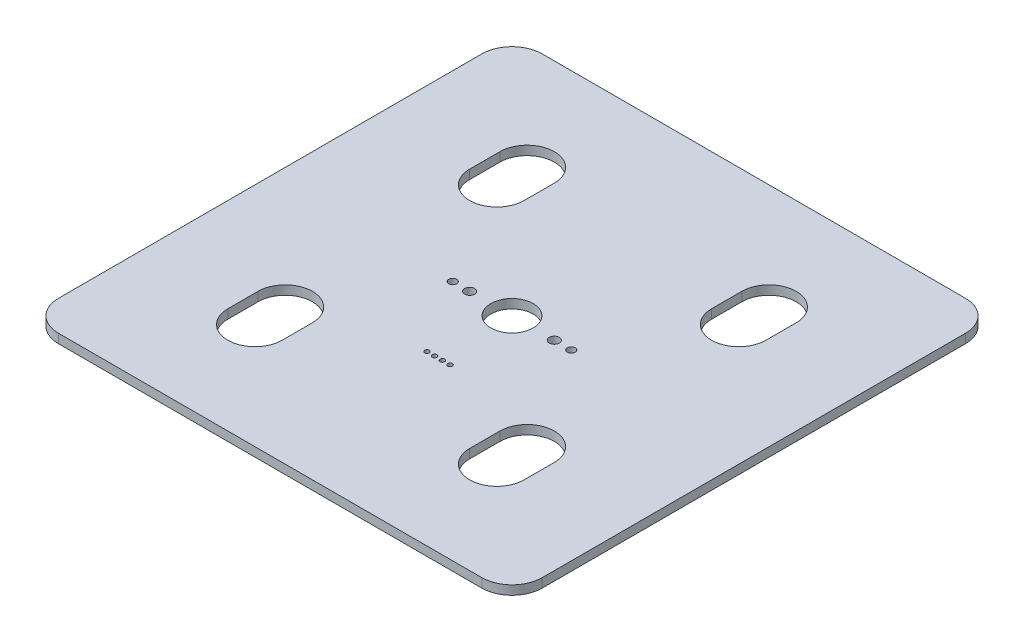
ISO-10303-21;
HEADER;
FILE_DESCRIPTION(('STEP AP214'),'2;1');
FILE_NAME('part.step','',(''),(''),'','','');
FILE_SCHEMA(('AUTOMOTIVE_DESIGN { 1 0 10303 214 1 1 1 1 }'));
ENDSEC;
DATA;
#1=APPLICATION_CONTEXT('core data for automotive mechanical design processes');
#2=APPLICATION_PROTOCOL_DEFINITION('international standard','automotive_design',2000,#1);
#3=PRODUCT_CONTEXT('',#1,'mechanical');
#4=PRODUCT('Part','Part','',(#3));
#5=PRODUCT_RELATED_PRODUCT_CATEGORY('part','',(#4));
#6=PRODUCT_DEFINITION_FORMATION('','',#4);
#7=PRODUCT_DEFINITION_CONTEXT('part definition',#1,'design');
#8=PRODUCT_DEFINITION('design','',#6,#7);
#9=PRODUCT_DEFINITION_SHAPE('','',#8);
#10=(LENGTH_UNIT() NAMED_UNIT(*) SI_UNIT(.MILLI.,.METRE.));
#11=(NAMED_UNIT(*) PLANE_ANGLE_UNIT() SI_UNIT($,.RADIAN.));
#12=(NAMED_UNIT(*) SI_UNIT($,.STERADIAN.) SOLID_ANGLE_UNIT());
#13=UNCERTAINTY_MEASURE_WITH_UNIT(LENGTH_MEASURE(1.E-05),#10,'distance_accuracy_value','');
#14=(GEOMETRIC_REPRESENTATION_CONTEXT(3) GLOBAL_UNCERTAINTY_ASSIGNED_CONTEXT((#13)) GLOBAL_UNIT_ASSIGNED_CONTEXT((#10,
#11,#12)) REPRESENTATION_CONTEXT('',''));
#15=CARTESIAN_POINT('',(0.,0.,0.));
#16=DIRECTION('',(0.,0.,1.));
#17=DIRECTION('',(1.,0.,0.));
#18=AXIS2_PLACEMENT_3D('',#15,#16,#17);
#19=CARTESIAN_POINT('',(35.,0.75,35.));
#20=DIRECTION('',(0.,-1.,0.));
#21=DIRECTION('',(0.,0.,-1.));
#22=AXIS2_PLACEMENT_3D('',#19,#20,#21);
#23=CYLINDRICAL_SURFACE('',#22,5.);
#24=DIRECTION('',(0.,-1.,0.));
#25=VECTOR('',#24,1.);
#26=CARTESIAN_POINT('',(40.,0.75,35.));
#27=LINE('',#26,#25);
#28=CARTESIAN_POINT('',(40.,0.75,35.));
#29=VERTEX_POINT('',#28);
#30=CARTESIAN_POINT('',(40.,-0.75,35.));
#31=VERTEX_POINT('',#30);
#32=EDGE_CURVE('E264',#29,#31,#27,.T.);
#33=ORIENTED_EDGE('',*,*,#32,.F.);
#34=CARTESIAN_POINT('',(35.,0.75,35.));
#35=DIRECTION('',(0.,-1.,0.));
#36=DIRECTION('',(0.,0.,-1.));
#37=AXIS2_PLACEMENT_3D('',#34,#35,#36);
#38=CIRCLE('',#37,5.);
#39=CARTESIAN_POINT('',(35.,0.75,40.));
#40=VERTEX_POINT('',#39);
#41=EDGE_CURVE('E45',#40,#29,#38,.F.);
#42=ORIENTED_EDGE('',*,*,#41,.F.);
#43=DIRECTION('',(0.,-1.,0.));
#44=VECTOR('',#43,1.);
#45=CARTESIAN_POINT('',(35.,0.75,40.));
#46=LINE('',#45,#44);
#47=CARTESIAN_POINT('',(35.,-0.75,40.));
#48=VERTEX_POINT('',#47);
#49=EDGE_CURVE('E266',#48,#40,#46,.F.);
#50=ORIENTED_EDGE('',*,*,#49,.F.);
#51=CARTESIAN_POINT('',(35.,-0.75,35.));
#52=DIRECTION('',(0.,-1.,0.));
#53=DIRECTION('',(0.,0.,-1.));
#54=AXIS2_PLACEMENT_3D('',#51,#52,#53);
#55=CIRCLE('',#54,5.);
#56=EDGE_CURVE('E11',#31,#48,#55,.T.);
#57=ORIENTED_EDGE('',*,*,#56,.F.);
#58=EDGE_LOOP('',(#33,#42,#50,#57));
#59=FACE_BOUND('',#58,.T.);
#60=ADVANCED_FACE('F37',(#59),#23,.T.);
#61=CARTESIAN_POINT('',(35.,0.75,-35.));
#62=DIRECTION('',(0.,-1.,0.));
#63=DIRECTION('',(0.,0.,-1.));
#64=AXIS2_PLACEMENT_3D('',#61,#62,#63);
#65=CYLINDRICAL_SURFACE('',#64,5.);
#66=DIRECTION('',(0.,-1.,0.));
#67=VECTOR('',#66,1.);
#68=CARTESIAN_POINT('',(35.,0.75,-40.));
#69=LINE('',#68,#67);
#70=CARTESIAN_POINT('',(35.,0.75,-40.));
#71=VERTEX_POINT('',#70);
#72=CARTESIAN_POINT('',(35.,-0.75,-40.));
#73=VERTEX_POINT('',#72);
#74=EDGE_CURVE('E255',#71,#73,#69,.T.);
#75=ORIENTED_EDGE('',*,*,#74,.F.);
#76=CARTESIAN_POINT('',(35.,0.75,-35.));
#77=DIRECTION('',(0.,-1.,0.));
#78=DIRECTION('',(0.,0.,-1.));
#79=AXIS2_PLACEMENT_3D('',#76,#77,#78);
#80=CIRCLE('',#79,5.);
#81=CARTESIAN_POINT('',(40.,0.75,-35.));
#82=VERTEX_POINT('',#81);
#83=EDGE_CURVE('E260',#82,#71,#80,.F.);
#84=ORIENTED_EDGE('',*,*,#83,.F.);
#85=DIRECTION('',(0.,-1.,0.));
#86=VECTOR('',#85,1.);
#87=CARTESIAN_POINT('',(40.,0.75,-35.));
#88=LINE('',#87,#86);
#89=CARTESIAN_POINT('',(40.,-0.75,-35.));
#90=VERTEX_POINT('',#89);
#91=EDGE_CURVE('E258',#90,#82,#88,.F.);
#92=ORIENTED_EDGE('',*,*,#91,.F.);
#93=CARTESIAN_POINT('',(35.,-0.75,-35.));
#94=DIRECTION('',(0.,-1.,0.));
#95=DIRECTION('',(0.,0.,-1.));
#96=AXIS2_PLACEMENT_3D('',#93,#94,#95);
#97=CIRCLE('',#96,5.);
#98=EDGE_CURVE('E262',#73,#90,#97,.T.);
#99=ORIENTED_EDGE('',*,*,#98,.F.);
#100=EDGE_LOOP('',(#75,#84,#92,#99));
#101=FACE_BOUND('',#100,.T.);
#102=ADVANCED_FACE('F372',(#101),#65,.T.);
#103=CARTESIAN_POINT('',(-35.,0.75,-35.));
#104=DIRECTION('',(0.,-1.,0.));
#105=DIRECTION('',(0.,0.,-1.));
#106=AXIS2_PLACEMENT_3D('',#103,#104,#105);
#107=CYLINDRICAL_SURFACE('',#106,5.);
#108=DIRECTION('',(0.,-1.,0.));
#109=VECTOR('',#108,1.);
#110=CARTESIAN_POINT('',(-40.,0.75,-35.));
#111=LINE('',#110,#109);
#112=CARTESIAN_POINT('',(-40.,0.75,-35.));
#113=VERTEX_POINT('',#112);
#114=CARTESIAN_POINT('',(-40.,-0.75,-35.));
#115=VERTEX_POINT('',#114);
#116=EDGE_CURVE('E244',#113,#115,#111,.T.);
#117=ORIENTED_EDGE('',*,*,#116,.F.);
#118=CARTESIAN_POINT('',(-35.,0.75,-35.));
#119=DIRECTION('',(0.,-1.,0.));
#120=DIRECTION('',(0.,0.,-1.));
#121=AXIS2_PLACEMENT_3D('',#118,#119,#120);
#122=CIRCLE('',#121,5.);
#123=CARTESIAN_POINT('',(-35.,0.75,-40.));
#124=VERTEX_POINT('',#123);
#125=EDGE_CURVE('E250',#124,#113,#122,.F.);
#126=ORIENTED_EDGE('',*,*,#125,.F.);
#127=DIRECTION('',(0.,-1.,0.));
#128=VECTOR('',#127,1.);
#129=CARTESIAN_POINT('',(-35.,0.75,-40.));
#130=LINE('',#129,#128);
#131=CARTESIAN_POINT('',(-35.,-0.75,-40.));
#132=VERTEX_POINT('',#131);
#133=EDGE_CURVE('E247',#132,#124,#130,.F.);
#134=ORIENTED_EDGE('',*,*,#133,.F.);
#135=CARTESIAN_POINT('',(-35.,-0.75,-35.));
#136=DIRECTION('',(0.,-1.,0.));
#137=DIRECTION('',(0.,0.,-1.));
#138=AXIS2_PLACEMENT_3D('',#135,#136,#137);
#139=CIRCLE('',#138,5.);
#140=EDGE_CURVE('E252',#115,#132,#139,.T.);
#141=ORIENTED_EDGE('',*,*,#140,.F.);
#142=EDGE_LOOP('',(#117,#126,#134,#141));
#143=FACE_BOUND('',#142,.T.);
#144=ADVANCED_FACE('F381',(#143),#107,.T.);
#145=CARTESIAN_POINT('',(-35.,0.75,35.));
#146=DIRECTION('',(0.,-1.,0.));
#147=DIRECTION('',(0.,0.,-1.));
#148=AXIS2_PLACEMENT_3D('',#145,#146,#147);
#149=CYLINDRICAL_SURFACE('',#148,5.);
#150=DIRECTION('',(0.,-1.,0.));
#151=VECTOR('',#150,1.);
#152=CARTESIAN_POINT('',(-35.,0.75,40.));
#153=LINE('',#152,#151);
#154=CARTESIAN_POINT('',(-35.,0.75,40.));
#155=VERTEX_POINT('',#154);
#156=CARTESIAN_POINT('',(-35.,-0.75,40.));
#157=VERTEX_POINT('',#156);
#158=EDGE_CURVE('E236',#155,#157,#153,.T.);
#159=ORIENTED_EDGE('',*,*,#158,.F.);
#160=CARTESIAN_POINT('',(-35.,0.75,35.));
#161=DIRECTION('',(0.,-1.,0.));
#162=DIRECTION('',(0.,0.,-1.));
#163=AXIS2_PLACEMENT_3D('',#160,#161,#162);
#164=CIRCLE('',#163,5.);
#165=CARTESIAN_POINT('',(-40.,0.75,35.));
#166=VERTEX_POINT('',#165);
#167=EDGE_CURVE('E241',#166,#155,#164,.F.);
#168=ORIENTED_EDGE('',*,*,#167,.F.);
#169=DIRECTION('',(0.,-1.,0.));
#170=VECTOR('',#169,1.);
#171=CARTESIAN_POINT('',(-40.,0.75,35.));
#172=LINE('',#171,#170);
#173=CARTESIAN_POINT('',(-40.,-0.75,35.));
#174=VERTEX_POINT('',#173);
#175=EDGE_CURVE('E238',#174,#166,#172,.F.);
#176=ORIENTED_EDGE('',*,*,#175,.F.);
#177=CARTESIAN_POINT('',(-35.,-0.75,35.));
#178=DIRECTION('',(0.,-1.,0.));
#179=DIRECTION('',(0.,0.,-1.));
#180=AXIS2_PLACEMENT_3D('',#177,#178,#179);
#181=CIRCLE('',#180,5.);
#182=EDGE_CURVE('E91',#157,#174,#181,.T.);
#183=ORIENTED_EDGE('',*,*,#182,.F.);
#184=EDGE_LOOP('',(#159,#168,#176,#183));
#185=FACE_BOUND('',#184,.T.);
#186=ADVANCED_FACE('F385',(#185),#149,.T.);
#187=CARTESIAN_POINT('',(40.,0.75,40.));
#188=DIRECTION('',(-1.,0.,0.));
#189=DIRECTION('',(0.,0.,1.));
#190=AXIS2_PLACEMENT_3D('',#187,#188,#189);
#191=PLANE('',#190);
#192=DIRECTION('',(0.,0.,-1.));
#193=VECTOR('',#192,1.);
#194=CARTESIAN_POINT('',(40.,0.75,40.));
#195=LINE('',#194,#193);
#196=EDGE_CURVE('E235',#29,#82,#195,.T.);
#197=ORIENTED_EDGE('',*,*,#196,.F.);
#198=ORIENTED_EDGE('',*,*,#32,.T.);
#199=DIRECTION('',(0.,0.,-1.));
#200=VECTOR('',#199,1.);
#201=CARTESIAN_POINT('',(40.,-0.75,40.));
#202=LINE('',#201,#200);
#203=EDGE_CURVE('E214',#31,#90,#202,.T.);
#204=ORIENTED_EDGE('',*,*,#203,.T.);
#205=ORIENTED_EDGE('',*,*,#91,.T.);
#206=EDGE_LOOP('',(#197,#198,#204,#205));
#207=FACE_BOUND('',#206,.T.);
#208=ADVANCED_FACE('F367',(#207),#191,.F.);
#209=CARTESIAN_POINT('',(-40.,0.75,-40.));
#210=DIRECTION('',(0.,0.,1.));
#211=DIRECTION('',(1.,0.,0.));
#212=AXIS2_PLACEMENT_3D('',#209,#210,#211);
#213=PLANE('',#212);
#214=DIRECTION('',(-1.,0.,0.));
#215=VECTOR('',#214,1.);
#216=CARTESIAN_POINT('',(-40.,0.75,-40.));
#217=LINE('',#216,#215);
#218=EDGE_CURVE('E353',#71,#124,#217,.T.);
#219=ORIENTED_EDGE('',*,*,#218,.F.);
#220=ORIENTED_EDGE('',*,*,#74,.T.);
#221=DIRECTION('',(-1.,0.,0.));
#222=VECTOR('',#221,1.);
#223=CARTESIAN_POINT('',(-40.,-0.75,-40.));
#224=LINE('',#223,#222);
#225=EDGE_CURVE('E218',#73,#132,#224,.T.);
#226=ORIENTED_EDGE('',*,*,#225,.T.);
#227=ORIENTED_EDGE('',*,*,#133,.T.);
#228=EDGE_LOOP('',(#219,#220,#226,#227));
#229=FACE_BOUND('',#228,.T.);
#230=ADVANCED_FACE('F376',(#229),#213,.F.);
#231=CARTESIAN_POINT('',(-40.,0.75,40.));
#232=DIRECTION('',(1.,0.,0.));
#233=DIRECTION('',(0.,0.,-1.));
#234=AXIS2_PLACEMENT_3D('',#231,#232,#233);
#235=PLANE('',#234);
#236=DIRECTION('',(0.,0.,1.));
#237=VECTOR('',#236,1.);
#238=CARTESIAN_POINT('',(-40.,0.75,40.));
#239=LINE('',#238,#237);
#240=EDGE_CURVE('E354',#113,#166,#239,.T.);
#241=ORIENTED_EDGE('',*,*,#240,.F.);
#242=ORIENTED_EDGE('',*,*,#116,.T.);
#243=DIRECTION('',(0.,0.,1.));
#244=VECTOR('',#243,1.);
#245=CARTESIAN_POINT('',(-40.,-0.75,40.));
#246=LINE('',#245,#244);
#247=EDGE_CURVE('E225',#115,#174,#246,.T.);
#248=ORIENTED_EDGE('',*,*,#247,.T.);
#249=ORIENTED_EDGE('',*,*,#175,.T.);
#250=EDGE_LOOP('',(#241,#242,#248,#249));
#251=FACE_BOUND('',#250,.T.);
#252=ADVANCED_FACE('F384',(#251),#235,.F.);
#253=CARTESIAN_POINT('',(-40.,0.75,40.));
#254=DIRECTION('',(0.,0.,-1.));
#255=DIRECTION('',(-1.,0.,0.));
#256=AXIS2_PLACEMENT_3D('',#253,#254,#255);
#257=PLANE('',#256);
#258=DIRECTION('',(1.,0.,0.));
#259=VECTOR('',#258,1.);
#260=CARTESIAN_POINT('',(-40.,-0.75,40.));
#261=LINE('',#260,#259);
#262=EDGE_CURVE('E232',#157,#48,#261,.T.);
#263=ORIENTED_EDGE('',*,*,#262,.T.);
#264=ORIENTED_EDGE('',*,*,#49,.T.);
#265=DIRECTION('',(1.,0.,0.));
#266=VECTOR('',#265,1.);
#267=CARTESIAN_POINT('',(-40.,0.75,40.));
#268=LINE('',#267,#266);
#269=EDGE_CURVE('E228',#155,#40,#268,.T.);
#270=ORIENTED_EDGE('',*,*,#269,.F.);
#271=ORIENTED_EDGE('',*,*,#158,.T.);
#272=EDGE_LOOP('',(#263,#264,#270,#271));
#273=FACE_BOUND('',#272,.T.);
#274=ADVANCED_FACE('F362',(#273),#257,.F.);
#275=CARTESIAN_POINT('',(0.,0.75,0.));
#276=DIRECTION('',(0.,-1.,0.));
#277=DIRECTION('',(0.,0.,-1.));
#278=AXIS2_PLACEMENT_3D('',#275,#276,#277);
#279=PLANE('',#278);
#280=CARTESIAN_POINT('',(-9.8,0.75,0.));
#281=DIRECTION('',(0.,-1.,0.));
#282=DIRECTION('',(0.,0.,-1.));
#283=AXIS2_PLACEMENT_3D('',#280,#281,#282);
#284=CIRCLE('',#283,0.649999999999999);
#285=CARTESIAN_POINT('',(-9.8,0.75,-0.649999999999998));
#286=VERTEX_POINT('',#285);
#287=EDGE_CURVE('E782',#286,#286,#284,.T.);
#288=ORIENTED_EDGE('',*,*,#287,.T.);
#289=EDGE_LOOP('',(#288));
#290=FACE_BOUND('',#289,.T.);
#291=CARTESIAN_POINT('',(9.8,0.75,0.));
#292=DIRECTION('',(0.,-1.,0.));
#293=DIRECTION('',(0.,0.,-1.));
#294=AXIS2_PLACEMENT_3D('',#291,#292,#293);
#295=CIRCLE('',#294,0.649999999999999);
#296=CARTESIAN_POINT('',(9.8,0.75,-0.649999999999998));
#297=VERTEX_POINT('',#296);
#298=EDGE_CURVE('E784',#297,#297,#295,.T.);
#299=ORIENTED_EDGE('',*,*,#298,.T.);
#300=EDGE_LOOP('',(#299));
#301=FACE_BOUND('',#300,.T.);
#302=CARTESIAN_POINT('',(0.634999999999999,0.75,12.15));
#303=DIRECTION('',(0.,-1.,0.));
#304=DIRECTION('',(0.,0.,-1.));
#305=AXIS2_PLACEMENT_3D('',#302,#303,#304);
#306=CIRCLE('',#305,0.38);
#307=CARTESIAN_POINT('',(0.634999999999999,0.75,11.77));
#308=VERTEX_POINT('',#307);
#309=EDGE_CURVE('E789',#308,#308,#306,.T.);
#310=ORIENTED_EDGE('',*,*,#309,.T.);
#311=EDGE_LOOP('',(#310));
#312=FACE_BOUND('',#311,.T.);
#313=CARTESIAN_POINT('',(1.905,0.75,12.15));
#314=DIRECTION('',(0.,-1.,0.));
#315=DIRECTION('',(0.,0.,-1.));
#316=AXIS2_PLACEMENT_3D('',#313,#314,#315);
#317=CIRCLE('',#316,0.380000000000002);
#318=CARTESIAN_POINT('',(1.905,0.75,11.77));
#319=VERTEX_POINT('',#318);
#320=EDGE_CURVE('E872',#319,#319,#317,.T.);
#321=ORIENTED_EDGE('',*,*,#320,.T.);
#322=EDGE_LOOP('',(#321));
#323=FACE_BOUND('',#322,.T.);
#324=CARTESIAN_POINT('',(7.,0.75,0.));
#325=DIRECTION('',(0.,-1.,0.));
#326=DIRECTION('',(0.,0.,-1.));
#327=AXIS2_PLACEMENT_3D('',#324,#325,#326);
#328=CIRCLE('',#327,0.825);
#329=CARTESIAN_POINT('',(7.,0.75,-0.824999999999999));
#330=VERTEX_POINT('',#329);
#331=EDGE_CURVE('E875',#330,#330,#328,.T.);
#332=ORIENTED_EDGE('',*,*,#331,.T.);
#333=EDGE_LOOP('',(#332));
#334=FACE_BOUND('',#333,.T.);
#335=CARTESIAN_POINT('',(-7.,0.75,0.));
#336=DIRECTION('',(0.,-1.,0.));
#337=DIRECTION('',(0.,0.,-1.));
#338=AXIS2_PLACEMENT_3D('',#335,#336,#337);
#339=CIRCLE('',#338,0.825);
#340=CARTESIAN_POINT('',(-7.,0.75,-0.824999999999999));
#341=VERTEX_POINT('',#340);
#342=EDGE_CURVE('E878',#341,#341,#339,.T.);
#343=ORIENTED_EDGE('',*,*,#342,.T.);
#344=EDGE_LOOP('',(#343));
#345=FACE_BOUND('',#344,.T.);
#346=CARTESIAN_POINT('',(-1.905,0.75,12.15));
#347=DIRECTION('',(0.,-1.,0.));
#348=DIRECTION('',(0.,0.,-1.));
#349=AXIS2_PLACEMENT_3D('',#346,#347,#348);
#350=CIRCLE('',#349,0.380000000000002);
#351=CARTESIAN_POINT('',(-1.905,0.75,11.77));
#352=VERTEX_POINT('',#351);
#353=EDGE_CURVE('E881',#352,#352,#350,.T.);
#354=ORIENTED_EDGE('',*,*,#353,.T.);
#355=EDGE_LOOP('',(#354));
#356=FACE_BOUND('',#355,.T.);
#357=CARTESIAN_POINT('',(-0.634999999999999,0.75,12.15));
#358=DIRECTION('',(0.,-1.,0.));
#359=DIRECTION('',(0.,0.,-1.));
#360=AXIS2_PLACEMENT_3D('',#357,#358,#359);
#361=CIRCLE('',#360,0.38);
#362=CARTESIAN_POINT('',(-0.634999999999999,0.75,11.77));
#363=VERTEX_POINT('',#362);
#364=EDGE_CURVE('E884',#363,#363,#361,.T.);
#365=ORIENTED_EDGE('',*,*,#364,.T.);
#366=EDGE_LOOP('',(#365));
#367=FACE_BOUND('',#366,.T.);
#368=CARTESIAN_POINT('',(0.,0.75,0.));
#369=DIRECTION('',(0.,-1.,0.));
#370=DIRECTION('',(0.,0.,-1.));
#371=AXIS2_PLACEMENT_3D('',#368,#369,#370);
#372=CIRCLE('',#371,3.5);
#373=CARTESIAN_POINT('',(0.,0.75,-3.5));
#374=VERTEX_POINT('',#373);
#375=EDGE_CURVE('E318',#374,#374,#372,.T.);
#376=ORIENTED_EDGE('',*,*,#375,.T.);
#377=EDGE_LOOP('',(#376));
#378=FACE_BOUND('',#377,.T.);
#379=DIRECTION('',(0.,0.,-1.));
#380=VECTOR('',#379,1.);
#381=CARTESIAN_POINT('',(24.5,0.75,-17.5));
#382=LINE('',#381,#380);
#383=CARTESIAN_POINT('',(24.5,0.75,-17.5));
#384=VERTEX_POINT('',#383);
#385=CARTESIAN_POINT('',(24.5,0.75,-22.5));
#386=VERTEX_POINT('',#385);
#387=EDGE_CURVE('E208',#384,#386,#382,.T.);
#388=ORIENTED_EDGE('',*,*,#387,.F.);
#389=CARTESIAN_POINT('',(20.,0.75,-17.5));
#390=DIRECTION('',(0.,1.,0.));
#391=DIRECTION('',(0.,0.,1.));
#392=AXIS2_PLACEMENT_3D('',#389,#390,#391);
#393=CIRCLE('',#392,4.5);
#394=CARTESIAN_POINT('',(15.5,0.75,-17.5));
#395=VERTEX_POINT('',#394);
#396=EDGE_CURVE('E40',#395,#384,#393,.T.);
#397=ORIENTED_EDGE('',*,*,#396,.F.);
#398=DIRECTION('',(0.,0.,1.));
#399=VECTOR('',#398,1.);
#400=CARTESIAN_POINT('',(15.5,0.75,-17.5));
#401=LINE('',#400,#399);
#402=CARTESIAN_POINT('',(15.5,0.75,-22.5));
#403=VERTEX_POINT('',#402);
#404=EDGE_CURVE('E82',#403,#395,#401,.T.);
#405=ORIENTED_EDGE('',*,*,#404,.F.);
#406=CARTESIAN_POINT('',(20.,0.75,-22.5));
#407=DIRECTION('',(0.,1.,0.));
#408=DIRECTION('',(0.,0.,1.));
#409=AXIS2_PLACEMENT_3D('',#406,#407,#408);
#410=CIRCLE('',#409,4.5);
#411=EDGE_CURVE('E210',#386,#403,#410,.T.);
#412=ORIENTED_EDGE('',*,*,#411,.F.);
#413=EDGE_LOOP('',(#388,#397,#405,#412));
#414=FACE_BOUND('',#413,.T.);
#415=DIRECTION('',(0.,0.,1.));
#416=VECTOR('',#415,1.);
#417=CARTESIAN_POINT('',(15.5,0.75,17.5));
#418=LINE('',#417,#416);
#419=CARTESIAN_POINT('',(15.5,0.75,17.5));
#420=VERTEX_POINT('',#419);
#421=CARTESIAN_POINT('',(15.5,0.75,22.5));
#422=VERTEX_POINT('',#421);
#423=EDGE_CURVE('E207',#420,#422,#418,.T.);
#424=ORIENTED_EDGE('',*,*,#423,.F.);
#425=CARTESIAN_POINT('',(20.,0.75,17.5));
#426=DIRECTION('',(0.,1.,0.));
#427=DIRECTION('',(0.,0.,1.));
#428=AXIS2_PLACEMENT_3D('',#425,#426,#427);
#429=CIRCLE('',#428,4.5);
#430=CARTESIAN_POINT('',(24.5,0.75,17.5));
#431=VERTEX_POINT('',#430);
#432=EDGE_CURVE('E195',#431,#420,#429,.T.);
#433=ORIENTED_EDGE('',*,*,#432,.F.);
#434=DIRECTION('',(0.,0.,-1.));
#435=VECTOR('',#434,1.);
#436=CARTESIAN_POINT('',(24.5,0.75,17.5));
#437=LINE('',#436,#435);
#438=CARTESIAN_POINT('',(24.5,0.75,22.5));
#439=VERTEX_POINT('',#438);
#440=EDGE_CURVE('E185',#439,#431,#437,.T.);
#441=ORIENTED_EDGE('',*,*,#440,.F.);
#442=CARTESIAN_POINT('',(20.,0.75,22.4999999999999));
#443=DIRECTION('',(0.,1.,0.));
#444=DIRECTION('',(0.,0.,1.));
#445=AXIS2_PLACEMENT_3D('',#442,#443,#444);
#446=CIRCLE('',#445,4.5);
#447=EDGE_CURVE('E179',#422,#439,#446,.T.);
#448=ORIENTED_EDGE('',*,*,#447,.F.);
#449=EDGE_LOOP('',(#424,#433,#441,#448));
#450=FACE_BOUND('',#449,.T.);
#451=DIRECTION('',(0.,0.,1.));
#452=VECTOR('',#451,1.);
#453=CARTESIAN_POINT('',(-24.5,0.75,17.5));
#454=LINE('',#453,#452);
#455=CARTESIAN_POINT('',(-24.5,0.75,17.5));
#456=VERTEX_POINT('',#455);
#457=CARTESIAN_POINT('',(-24.5,0.75,22.5));
#458=VERTEX_POINT('',#457);
#459=EDGE_CURVE('E280',#456,#458,#454,.T.);
#460=ORIENTED_EDGE('',*,*,#459,.F.);
#461=CARTESIAN_POINT('',(-20.,0.75,17.5));
#462=DIRECTION('',(0.,1.,0.));
#463=DIRECTION('',(0.,0.,1.));
#464=AXIS2_PLACEMENT_3D('',#461,#462,#463);
#465=CIRCLE('',#464,4.5);
#466=CARTESIAN_POINT('',(-15.5,0.75,17.5));
#467=VERTEX_POINT('',#466);
#468=EDGE_CURVE('E286',#467,#456,#465,.T.);
#469=ORIENTED_EDGE('',*,*,#468,.F.);
#470=DIRECTION('',(0.,0.,-1.));
#471=VECTOR('',#470,1.);
#472=CARTESIAN_POINT('',(-15.5,0.75,17.5));
#473=LINE('',#472,#471);
#474=CARTESIAN_POINT('',(-15.5,0.75,22.5));
#475=VERTEX_POINT('',#474);
#476=EDGE_CURVE('E284',#475,#467,#473,.T.);
#477=ORIENTED_EDGE('',*,*,#476,.F.);
#478=CARTESIAN_POINT('',(-20.,0.75,22.5));
#479=DIRECTION('',(0.,1.,0.));
#480=DIRECTION('',(0.,0.,1.));
#481=AXIS2_PLACEMENT_3D('',#478,#479,#480);
#482=CIRCLE('',#481,4.5);
#483=EDGE_CURVE('E282',#458,#475,#482,.T.);
#484=ORIENTED_EDGE('',*,*,#483,.F.);
#485=EDGE_LOOP('',(#460,#469,#477,#484));
#486=FACE_BOUND('',#485,.T.);
#487=DIRECTION('',(0.,0.,-1.));
#488=VECTOR('',#487,1.);
#489=CARTESIAN_POINT('',(-15.5,0.75,-17.5));
#490=LINE('',#489,#488);
#491=CARTESIAN_POINT('',(-15.5,0.75,-17.5));
#492=VERTEX_POINT('',#491);
#493=CARTESIAN_POINT('',(-15.5,0.75,-22.5));
#494=VERTEX_POINT('',#493);
#495=EDGE_CURVE('E270',#492,#494,#490,.T.);
#496=ORIENTED_EDGE('',*,*,#495,.F.);
#497=CARTESIAN_POINT('',(-20.,0.75,-17.5));
#498=DIRECTION('',(0.,1.,0.));
#499=DIRECTION('',(0.,0.,1.));
#500=AXIS2_PLACEMENT_3D('',#497,#498,#499);
#501=CIRCLE('',#500,4.5);
#502=CARTESIAN_POINT('',(-24.5,0.75,-17.5));
#503=VERTEX_POINT('',#502);
#504=EDGE_CURVE('E277',#503,#492,#501,.T.);
#505=ORIENTED_EDGE('',*,*,#504,.F.);
#506=DIRECTION('',(0.,0.,1.));
#507=VECTOR('',#506,1.);
#508=CARTESIAN_POINT('',(-24.5,0.75,-17.5));
#509=LINE('',#508,#507);
#510=CARTESIAN_POINT('',(-24.5,0.75,-22.5));
#511=VERTEX_POINT('',#510);
#512=EDGE_CURVE('E275',#511,#503,#509,.T.);
#513=ORIENTED_EDGE('',*,*,#512,.F.);
#514=CARTESIAN_POINT('',(-20.,0.75,-22.5));
#515=DIRECTION('',(0.,1.,0.));
#516=DIRECTION('',(0.,0.,1.));
#517=AXIS2_PLACEMENT_3D('',#514,#515,#516);
#518=CIRCLE('',#517,4.5);
#519=EDGE_CURVE('E272',#494,#511,#518,.T.);
#520=ORIENTED_EDGE('',*,*,#519,.F.);
#521=EDGE_LOOP('',(#496,#505,#513,#520));
#522=FACE_BOUND('',#521,.T.);
#523=ORIENTED_EDGE('',*,*,#269,.T.);
#524=ORIENTED_EDGE('',*,*,#41,.T.);
#525=ORIENTED_EDGE('',*,*,#196,.T.);
#526=ORIENTED_EDGE('',*,*,#83,.T.);
#527=ORIENTED_EDGE('',*,*,#218,.T.);
#528=ORIENTED_EDGE('',*,*,#125,.T.);
#529=ORIENTED_EDGE('',*,*,#240,.T.);
#530=ORIENTED_EDGE('',*,*,#167,.T.);
#531=EDGE_LOOP('',(#523,#524,#525,#526,#527,#528,#529,#530));
#532=FACE_BOUND('',#531,.T.);
#533=ADVANCED_FACE('F205',(#290,#301,#312,#323,#334,#345,#356,#367,#378,#414,#450,#486,#522,
#532),#279,.F.);
#534=CARTESIAN_POINT('',(0.,-0.75,0.));
#535=DIRECTION('',(0.,-1.,0.));
#536=DIRECTION('',(0.,0.,-1.));
#537=AXIS2_PLACEMENT_3D('',#534,#535,#536);
#538=PLANE('',#537);
#539=CARTESIAN_POINT('',(-9.8,-0.75,0.));
#540=DIRECTION('',(0.,1.,0.));
#541=DIRECTION('',(0.,0.,1.));
#542=AXIS2_PLACEMENT_3D('',#539,#540,#541);
#543=CIRCLE('',#542,0.649999999999999);
#544=CARTESIAN_POINT('',(-9.8,-0.75,0.65));
#545=VERTEX_POINT('',#544);
#546=EDGE_CURVE('E779',#545,#545,#543,.T.);
#547=ORIENTED_EDGE('',*,*,#546,.T.);
#548=EDGE_LOOP('',(#547));
#549=FACE_BOUND('',#548,.T.);
#550=CARTESIAN_POINT('',(9.8,-0.75,0.));
#551=DIRECTION('',(0.,1.,0.));
#552=DIRECTION('',(0.,0.,-1.));
#553=AXIS2_PLACEMENT_3D('',#550,#551,#552);
#554=CIRCLE('',#553,0.649999999999999);
#555=CARTESIAN_POINT('',(9.8,-0.75,-0.649999999999998));
#556=VERTEX_POINT('',#555);
#557=EDGE_CURVE('E891',#556,#556,#554,.T.);
#558=ORIENTED_EDGE('',*,*,#557,.T.);
#559=EDGE_LOOP('',(#558));
#560=FACE_BOUND('',#559,.T.);
#561=CARTESIAN_POINT('',(0.634999999999999,-0.75,12.15));
#562=DIRECTION('',(0.,1.,0.));
#563=DIRECTION('',(0.,0.,-1.));
#564=AXIS2_PLACEMENT_3D('',#561,#562,#563);
#565=CIRCLE('',#564,0.38);
#566=CARTESIAN_POINT('',(0.634999999999999,-0.75,11.77));
#567=VERTEX_POINT('',#566);
#568=EDGE_CURVE('E900',#567,#567,#565,.T.);
#569=ORIENTED_EDGE('',*,*,#568,.T.);
#570=EDGE_LOOP('',(#569));
#571=FACE_BOUND('',#570,.T.);
#572=CARTESIAN_POINT('',(1.905,-0.75,12.15));
#573=DIRECTION('',(0.,1.,0.));
#574=DIRECTION('',(0.,0.,-1.));
#575=AXIS2_PLACEMENT_3D('',#572,#573,#574);
#576=CIRCLE('',#575,0.380000000000002);
#577=CARTESIAN_POINT('',(1.905,-0.75,11.77));
#578=VERTEX_POINT('',#577);
#579=EDGE_CURVE('E903',#578,#578,#576,.T.);
#580=ORIENTED_EDGE('',*,*,#579,.T.);
#581=EDGE_LOOP('',(#580));
#582=FACE_BOUND('',#581,.T.);
#583=CARTESIAN_POINT('',(7.,-0.75,0.));
#584=DIRECTION('',(0.,1.,0.));
#585=DIRECTION('',(0.,0.,-1.));
#586=AXIS2_PLACEMENT_3D('',#583,#584,#585);
#587=CIRCLE('',#586,0.825);
#588=CARTESIAN_POINT('',(7.,-0.75,-0.824999999999999));
#589=VERTEX_POINT('',#588);
#590=EDGE_CURVE('E887',#589,#589,#587,.T.);
#591=ORIENTED_EDGE('',*,*,#590,.T.);
#592=EDGE_LOOP('',(#591));
#593=FACE_BOUND('',#592,.T.);
#594=CARTESIAN_POINT('',(-7.,-0.75,0.));
#595=DIRECTION('',(0.,1.,0.));
#596=DIRECTION('',(0.,0.,1.));
#597=AXIS2_PLACEMENT_3D('',#594,#595,#596);
#598=CIRCLE('',#597,0.825);
#599=CARTESIAN_POINT('',(-7.,-0.75,0.825000000000001));
#600=VERTEX_POINT('',#599);
#601=EDGE_CURVE('E890',#600,#600,#598,.T.);
#602=ORIENTED_EDGE('',*,*,#601,.T.);
#603=EDGE_LOOP('',(#602));
#604=FACE_BOUND('',#603,.T.);
#605=CARTESIAN_POINT('',(-1.905,-0.75,12.15));
#606=DIRECTION('',(0.,1.,0.));
#607=DIRECTION('',(0.,0.,1.));
#608=AXIS2_PLACEMENT_3D('',#605,#606,#607);
#609=CIRCLE('',#608,0.380000000000002);
#610=CARTESIAN_POINT('',(-1.905,-0.75,12.53));
#611=VERTEX_POINT('',#610);
#612=EDGE_CURVE('E894',#611,#611,#609,.T.);
#613=ORIENTED_EDGE('',*,*,#612,.T.);
#614=EDGE_LOOP('',(#613));
#615=FACE_BOUND('',#614,.T.);
#616=CARTESIAN_POINT('',(-0.634999999999999,-0.75,12.15));
#617=DIRECTION('',(0.,1.,0.));
#618=DIRECTION('',(0.,0.,1.));
#619=AXIS2_PLACEMENT_3D('',#616,#617,#618);
#620=CIRCLE('',#619,0.38);
#621=CARTESIAN_POINT('',(-0.634999999999999,-0.75,12.53));
#622=VERTEX_POINT('',#621);
#623=EDGE_CURVE('E897',#622,#622,#620,.T.);
#624=ORIENTED_EDGE('',*,*,#623,.T.);
#625=EDGE_LOOP('',(#624));
#626=FACE_BOUND('',#625,.T.);
#627=CARTESIAN_POINT('',(0.,-0.75,0.));
#628=DIRECTION('',(0.,1.,0.));
#629=DIRECTION('',(0.,0.,1.));
#630=AXIS2_PLACEMENT_3D('',#627,#628,#629);
#631=CIRCLE('',#630,3.5);
#632=CARTESIAN_POINT('',(0.,-0.75,3.5));
#633=VERTEX_POINT('',#632);
#634=EDGE_CURVE('E783',#633,#633,#631,.T.);
#635=ORIENTED_EDGE('',*,*,#634,.T.);
#636=EDGE_LOOP('',(#635));
#637=FACE_BOUND('',#636,.T.);
#638=CARTESIAN_POINT('',(20.,-0.75,-17.5));
#639=DIRECTION('',(0.,1.,0.));
#640=DIRECTION('',(0.,0.,-1.));
#641=AXIS2_PLACEMENT_3D('',#638,#639,#640);
#642=CIRCLE('',#641,4.5);
#643=CARTESIAN_POINT('',(15.5,-0.75,-17.5));
#644=VERTEX_POINT('',#643);
#645=CARTESIAN_POINT('',(24.5,-0.75,-17.5));
#646=VERTEX_POINT('',#645);
#647=EDGE_CURVE('E203',#644,#646,#642,.T.);
#648=ORIENTED_EDGE('',*,*,#647,.T.);
#649=DIRECTION('',(0.,0.,-1.));
#650=VECTOR('',#649,1.);
#651=CARTESIAN_POINT('',(24.5,-0.75,-17.5));
#652=LINE('',#651,#650);
#653=CARTESIAN_POINT('',(24.5,-0.75,-22.5));
#654=VERTEX_POINT('',#653);
#655=EDGE_CURVE('E325',#646,#654,#652,.T.);
#656=ORIENTED_EDGE('',*,*,#655,.T.);
#657=CARTESIAN_POINT('',(20.,-0.75,-22.5));
#658=DIRECTION('',(0.,1.,0.));
#659=DIRECTION('',(0.,0.,-1.));
#660=AXIS2_PLACEMENT_3D('',#657,#658,#659);
#661=CIRCLE('',#660,4.5);
#662=CARTESIAN_POINT('',(15.5,-0.75,-22.5));
#663=VERTEX_POINT('',#662);
#664=EDGE_CURVE('E322',#654,#663,#661,.T.);
#665=ORIENTED_EDGE('',*,*,#664,.T.);
#666=DIRECTION('',(0.,0.,1.));
#667=VECTOR('',#666,1.);
#668=CARTESIAN_POINT('',(15.5,-0.75,-17.5));
#669=LINE('',#668,#667);
#670=EDGE_CURVE('E315',#663,#644,#669,.T.);
#671=ORIENTED_EDGE('',*,*,#670,.T.);
#672=EDGE_LOOP('',(#648,#656,#665,#671));
#673=FACE_BOUND('',#672,.T.);
#674=CARTESIAN_POINT('',(20.,-0.75,17.5));
#675=DIRECTION('',(0.,1.,0.));
#676=DIRECTION('',(0.,0.,-1.));
#677=AXIS2_PLACEMENT_3D('',#674,#675,#676);
#678=CIRCLE('',#677,4.5);
#679=CARTESIAN_POINT('',(24.5,-0.75,17.5));
#680=VERTEX_POINT('',#679);
#681=CARTESIAN_POINT('',(15.5,-0.75,17.5));
#682=VERTEX_POINT('',#681);
#683=EDGE_CURVE('E201',#680,#682,#678,.T.);
#684=ORIENTED_EDGE('',*,*,#683,.T.);
#685=DIRECTION('',(0.,0.,1.));
#686=VECTOR('',#685,1.);
#687=CARTESIAN_POINT('',(15.5,-0.75,17.5));
#688=LINE('',#687,#686);
#689=CARTESIAN_POINT('',(15.5,-0.75,22.5));
#690=VERTEX_POINT('',#689);
#691=EDGE_CURVE('E306',#682,#690,#688,.T.);
#692=ORIENTED_EDGE('',*,*,#691,.T.);
#693=CARTESIAN_POINT('',(20.,-0.75,22.4999999999999));
#694=DIRECTION('',(0.,1.,0.));
#695=DIRECTION('',(0.,0.,-1.));
#696=AXIS2_PLACEMENT_3D('',#693,#694,#695);
#697=CIRCLE('',#696,4.5);
#698=CARTESIAN_POINT('',(24.5,-0.75,22.5));
#699=VERTEX_POINT('',#698);
#700=EDGE_CURVE('E295',#690,#699,#697,.T.);
#701=ORIENTED_EDGE('',*,*,#700,.T.);
#702=DIRECTION('',(0.,0.,-1.));
#703=VECTOR('',#702,1.);
#704=CARTESIAN_POINT('',(24.5,-0.75,17.5));
#705=LINE('',#704,#703);
#706=EDGE_CURVE('E297',#699,#680,#705,.T.);
#707=ORIENTED_EDGE('',*,*,#706,.T.);
#708=EDGE_LOOP('',(#684,#692,#701,#707));
#709=FACE_BOUND('',#708,.T.);
#710=CARTESIAN_POINT('',(-20.,-0.75,17.5));
#711=DIRECTION('',(0.,1.,0.));
#712=DIRECTION('',(0.,0.,1.));
#713=AXIS2_PLACEMENT_3D('',#710,#711,#712);
#714=CIRCLE('',#713,4.5);
#715=CARTESIAN_POINT('',(-15.5,-0.75,17.5));
#716=VERTEX_POINT('',#715);
#717=CARTESIAN_POINT('',(-24.5,-0.75,17.5));
#718=VERTEX_POINT('',#717);
#719=EDGE_CURVE('E301',#716,#718,#714,.T.);
#720=ORIENTED_EDGE('',*,*,#719,.T.);
#721=DIRECTION('',(0.,0.,1.));
#722=VECTOR('',#721,1.);
#723=CARTESIAN_POINT('',(-24.5,-0.75,17.5));
#724=LINE('',#723,#722);
#725=CARTESIAN_POINT('',(-24.5,-0.75,22.5));
#726=VERTEX_POINT('',#725);
#727=EDGE_CURVE('E810',#718,#726,#724,.T.);
#728=ORIENTED_EDGE('',*,*,#727,.T.);
#729=CARTESIAN_POINT('',(-20.,-0.75,22.5));
#730=DIRECTION('',(0.,1.,0.));
#731=DIRECTION('',(0.,0.,1.));
#732=AXIS2_PLACEMENT_3D('',#729,#730,#731);
#733=CIRCLE('',#732,4.5);
#734=CARTESIAN_POINT('',(-15.5,-0.75,22.5));
#735=VERTEX_POINT('',#734);
#736=EDGE_CURVE('E808',#726,#735,#733,.T.);
#737=ORIENTED_EDGE('',*,*,#736,.T.);
#738=DIRECTION('',(0.,0.,-1.));
#739=VECTOR('',#738,1.);
#740=CARTESIAN_POINT('',(-15.5,-0.75,17.5));
#741=LINE('',#740,#739);
#742=EDGE_CURVE('E801',#735,#716,#741,.T.);
#743=ORIENTED_EDGE('',*,*,#742,.T.);
#744=EDGE_LOOP('',(#720,#728,#737,#743));
#745=FACE_BOUND('',#744,.T.);
#746=CARTESIAN_POINT('',(-20.,-0.75,-17.5));
#747=DIRECTION('',(0.,1.,0.));
#748=DIRECTION('',(0.,0.,1.));
#749=AXIS2_PLACEMENT_3D('',#746,#747,#748);
#750=CIRCLE('',#749,4.5);
#751=CARTESIAN_POINT('',(-24.5,-0.75,-17.5));
#752=VERTEX_POINT('',#751);
#753=CARTESIAN_POINT('',(-15.5,-0.75,-17.5));
#754=VERTEX_POINT('',#753);
#755=EDGE_CURVE('E330',#752,#754,#750,.T.);
#756=ORIENTED_EDGE('',*,*,#755,.T.);
#757=DIRECTION('',(0.,0.,-1.));
#758=VECTOR('',#757,1.);
#759=CARTESIAN_POINT('',(-15.5,-0.75,-17.5));
#760=LINE('',#759,#758);
#761=CARTESIAN_POINT('',(-15.5,-0.75,-22.5));
#762=VERTEX_POINT('',#761);
#763=EDGE_CURVE('E333',#754,#762,#760,.T.);
#764=ORIENTED_EDGE('',*,*,#763,.T.);
#765=CARTESIAN_POINT('',(-20.,-0.75,-22.5));
#766=DIRECTION('',(0.,1.,0.));
#767=DIRECTION('',(0.,0.,1.));
#768=AXIS2_PLACEMENT_3D('',#765,#766,#767);
#769=CIRCLE('',#768,4.5);
#770=CARTESIAN_POINT('',(-24.5,-0.75,-22.5));
#771=VERTEX_POINT('',#770);
#772=EDGE_CURVE('E336',#762,#771,#769,.T.);
#773=ORIENTED_EDGE('',*,*,#772,.T.);
#774=DIRECTION('',(0.,0.,1.));
#775=VECTOR('',#774,1.);
#776=CARTESIAN_POINT('',(-24.5,-0.75,-17.5));
#777=LINE('',#776,#775);
#778=EDGE_CURVE('E339',#771,#752,#777,.T.);
#779=ORIENTED_EDGE('',*,*,#778,.T.);
#780=EDGE_LOOP('',(#756,#764,#773,#779));
#781=FACE_BOUND('',#780,.T.);
#782=ORIENTED_EDGE('',*,*,#203,.F.);
#783=ORIENTED_EDGE('',*,*,#56,.T.);
#784=ORIENTED_EDGE('',*,*,#262,.F.);
#785=ORIENTED_EDGE('',*,*,#182,.T.);
#786=ORIENTED_EDGE('',*,*,#247,.F.);
#787=ORIENTED_EDGE('',*,*,#140,.T.);
#788=ORIENTED_EDGE('',*,*,#225,.F.);
#789=ORIENTED_EDGE('',*,*,#98,.T.);
#790=EDGE_LOOP('',(#782,#783,#784,#785,#786,#787,#788,#789));
#791=FACE_BOUND('',#790,.T.);
#792=ADVANCED_FACE('F436',(#549,#560,#571,#582,#593,#604,#615,#626,#637,#673,#709,#745,#781,
#791),#538,.T.);
#793=CARTESIAN_POINT('',(-20.,-0.75,-17.5));
#794=DIRECTION('',(0.,1.,0.));
#795=DIRECTION('',(0.,0.,1.));
#796=AXIS2_PLACEMENT_3D('',#793,#794,#795);
#797=CYLINDRICAL_SURFACE('',#796,4.5);
#798=DIRECTION('',(0.,1.,0.));
#799=VECTOR('',#798,1.);
#800=CARTESIAN_POINT('',(-15.5,-0.75,-17.5));
#801=LINE('',#800,#799);
#802=EDGE_CURVE('E342',#754,#492,#801,.T.);
#803=ORIENTED_EDGE('',*,*,#802,.F.);
#804=ORIENTED_EDGE('',*,*,#755,.F.);
#805=DIRECTION('',(0.,1.,0.));
#806=VECTOR('',#805,1.);
#807=CARTESIAN_POINT('',(-24.5,-0.75,-17.5));
#808=LINE('',#807,#806);
#809=EDGE_CURVE('E273',#752,#503,#808,.T.);
#810=ORIENTED_EDGE('',*,*,#809,.T.);
#811=ORIENTED_EDGE('',*,*,#504,.T.);
#812=EDGE_LOOP('',(#803,#804,#810,#811));
#813=FACE_BOUND('',#812,.T.);
#814=ADVANCED_FACE('F445',(#813),#797,.F.);
#815=CARTESIAN_POINT('',(-24.5,-0.75,-17.5));
#816=DIRECTION('',(-1.,0.,0.));
#817=DIRECTION('',(0.,0.,1.));
#818=AXIS2_PLACEMENT_3D('',#815,#816,#817);
#819=PLANE('',#818);
#820=ORIENTED_EDGE('',*,*,#809,.F.);
#821=ORIENTED_EDGE('',*,*,#778,.F.);
#822=DIRECTION('',(0.,1.,0.));
#823=VECTOR('',#822,1.);
#824=CARTESIAN_POINT('',(-24.5,-0.75,-22.5));
#825=LINE('',#824,#823);
#826=EDGE_CURVE('E343',#771,#511,#825,.T.);
#827=ORIENTED_EDGE('',*,*,#826,.T.);
#828=ORIENTED_EDGE('',*,*,#512,.T.);
#829=EDGE_LOOP('',(#820,#821,#827,#828));
#830=FACE_BOUND('',#829,.T.);
#831=ADVANCED_FACE('F453',(#830),#819,.F.);
#832=CARTESIAN_POINT('',(-20.,-0.75,-22.5));
#833=DIRECTION('',(0.,1.,0.));
#834=DIRECTION('',(0.,0.,1.));
#835=AXIS2_PLACEMENT_3D('',#832,#833,#834);
#836=CYLINDRICAL_SURFACE('',#835,4.5);
#837=ORIENTED_EDGE('',*,*,#826,.F.);
#838=ORIENTED_EDGE('',*,*,#772,.F.);
#839=DIRECTION('',(0.,1.,0.));
#840=VECTOR('',#839,1.);
#841=CARTESIAN_POINT('',(-15.5,-0.75,-22.5));
#842=LINE('',#841,#840);
#843=EDGE_CURVE('E346',#762,#494,#842,.T.);
#844=ORIENTED_EDGE('',*,*,#843,.T.);
#845=ORIENTED_EDGE('',*,*,#519,.T.);
#846=EDGE_LOOP('',(#837,#838,#844,#845));
#847=FACE_BOUND('',#846,.T.);
#848=ADVANCED_FACE('F461',(#847),#836,.F.);
#849=CARTESIAN_POINT('',(-15.5,-0.75,-17.5));
#850=DIRECTION('',(1.,0.,0.));
#851=DIRECTION('',(0.,0.,-1.));
#852=AXIS2_PLACEMENT_3D('',#849,#850,#851);
#853=PLANE('',#852);
#854=ORIENTED_EDGE('',*,*,#843,.F.);
#855=ORIENTED_EDGE('',*,*,#763,.F.);
#856=ORIENTED_EDGE('',*,*,#802,.T.);
#857=ORIENTED_EDGE('',*,*,#495,.T.);
#858=EDGE_LOOP('',(#854,#855,#856,#857));
#859=FACE_BOUND('',#858,.T.);
#860=ADVANCED_FACE('F469',(#859),#853,.F.);
#861=CARTESIAN_POINT('',(-20.,-0.75,17.5));
#862=DIRECTION('',(0.,1.,0.));
#863=DIRECTION('',(0.,0.,1.));
#864=AXIS2_PLACEMENT_3D('',#861,#862,#863);
#865=CYLINDRICAL_SURFACE('',#864,4.5);
#866=DIRECTION('',(0.,1.,0.));
#867=VECTOR('',#866,1.);
#868=CARTESIAN_POINT('',(-24.5,-0.75,17.5));
#869=LINE('',#868,#867);
#870=EDGE_CURVE('E798',#718,#456,#869,.T.);
#871=ORIENTED_EDGE('',*,*,#870,.F.);
#872=ORIENTED_EDGE('',*,*,#719,.F.);
#873=DIRECTION('',(0.,1.,0.));
#874=VECTOR('',#873,1.);
#875=CARTESIAN_POINT('',(-15.5,-0.75,17.5));
#876=LINE('',#875,#874);
#877=EDGE_CURVE('E309',#716,#467,#876,.T.);
#878=ORIENTED_EDGE('',*,*,#877,.T.);
#879=ORIENTED_EDGE('',*,*,#468,.T.);
#880=EDGE_LOOP('',(#871,#872,#878,#879));
#881=FACE_BOUND('',#880,.T.);
#882=ADVANCED_FACE('F477',(#881),#865,.F.);
#883=CARTESIAN_POINT('',(-15.5,-0.75,17.5));
#884=DIRECTION('',(1.,0.,0.));
#885=DIRECTION('',(0.,0.,-1.));
#886=AXIS2_PLACEMENT_3D('',#883,#884,#885);
#887=PLANE('',#886);
#888=ORIENTED_EDGE('',*,*,#877,.F.);
#889=ORIENTED_EDGE('',*,*,#742,.F.);
#890=DIRECTION('',(0.,1.,0.));
#891=VECTOR('',#890,1.);
#892=CARTESIAN_POINT('',(-15.5,-0.75,22.5));
#893=LINE('',#892,#891);
#894=EDGE_CURVE('E799',#735,#475,#893,.T.);
#895=ORIENTED_EDGE('',*,*,#894,.T.);
#896=ORIENTED_EDGE('',*,*,#476,.T.);
#897=EDGE_LOOP('',(#888,#889,#895,#896));
#898=FACE_BOUND('',#897,.T.);
#899=ADVANCED_FACE('F485',(#898),#887,.F.);
#900=CARTESIAN_POINT('',(-20.,-0.75,22.5));
#901=DIRECTION('',(0.,1.,0.));
#902=DIRECTION('',(0.,0.,1.));
#903=AXIS2_PLACEMENT_3D('',#900,#901,#902);
#904=CYLINDRICAL_SURFACE('',#903,4.5);
#905=ORIENTED_EDGE('',*,*,#894,.F.);
#906=ORIENTED_EDGE('',*,*,#736,.F.);
#907=DIRECTION('',(0.,1.,0.));
#908=VECTOR('',#907,1.);
#909=CARTESIAN_POINT('',(-24.5,-0.75,22.5));
#910=LINE('',#909,#908);
#911=EDGE_CURVE('E795',#726,#458,#910,.T.);
#912=ORIENTED_EDGE('',*,*,#911,.T.);
#913=ORIENTED_EDGE('',*,*,#483,.T.);
#914=EDGE_LOOP('',(#905,#906,#912,#913));
#915=FACE_BOUND('',#914,.T.);
#916=ADVANCED_FACE('F493',(#915),#904,.F.);
#917=CARTESIAN_POINT('',(-24.5,-0.75,17.5));
#918=DIRECTION('',(-1.,0.,0.));
#919=DIRECTION('',(0.,0.,1.));
#920=AXIS2_PLACEMENT_3D('',#917,#918,#919);
#921=PLANE('',#920);
#922=ORIENTED_EDGE('',*,*,#911,.F.);
#923=ORIENTED_EDGE('',*,*,#727,.F.);
#924=ORIENTED_EDGE('',*,*,#870,.T.);
#925=ORIENTED_EDGE('',*,*,#459,.T.);
#926=EDGE_LOOP('',(#922,#923,#924,#925));
#927=FACE_BOUND('',#926,.T.);
#928=ADVANCED_FACE('F501',(#927),#921,.F.);
#929=CARTESIAN_POINT('',(20.,-0.75,17.5));
#930=DIRECTION('',(0.,1.,0.));
#931=DIRECTION('',(0.,0.,1.));
#932=AXIS2_PLACEMENT_3D('',#929,#930,#931);
#933=CYLINDRICAL_SURFACE('',#932,4.5);
#934=DIRECTION('',(0.,1.,0.));
#935=VECTOR('',#934,1.);
#936=CARTESIAN_POINT('',(15.5,-0.75,17.5));
#937=LINE('',#936,#935);
#938=EDGE_CURVE('E62',#682,#420,#937,.T.);
#939=ORIENTED_EDGE('',*,*,#938,.F.);
#940=ORIENTED_EDGE('',*,*,#683,.F.);
#941=DIRECTION('',(0.,1.,0.));
#942=VECTOR('',#941,1.);
#943=CARTESIAN_POINT('',(24.5,-0.75,17.5));
#944=LINE('',#943,#942);
#945=EDGE_CURVE('E190',#680,#431,#944,.T.);
#946=ORIENTED_EDGE('',*,*,#945,.T.);
#947=ORIENTED_EDGE('',*,*,#432,.T.);
#948=EDGE_LOOP('',(#939,#940,#946,#947));
#949=FACE_BOUND('',#948,.T.);
#950=ADVANCED_FACE('F198',(#949),#933,.F.);
#951=CARTESIAN_POINT('',(24.5,-0.75,17.5));
#952=DIRECTION('',(1.,0.,0.));
#953=DIRECTION('',(0.,0.,-1.));
#954=AXIS2_PLACEMENT_3D('',#951,#952,#953);
#955=PLANE('',#954);
#956=ORIENTED_EDGE('',*,*,#945,.F.);
#957=ORIENTED_EDGE('',*,*,#706,.F.);
#958=DIRECTION('',(0.,1.,0.));
#959=VECTOR('',#958,1.);
#960=CARTESIAN_POINT('',(24.5,-0.75,22.5));
#961=LINE('',#960,#959);
#962=EDGE_CURVE('E192',#699,#439,#961,.T.);
#963=ORIENTED_EDGE('',*,*,#962,.T.);
#964=ORIENTED_EDGE('',*,*,#440,.T.);
#965=EDGE_LOOP('',(#956,#957,#963,#964));
#966=FACE_BOUND('',#965,.T.);
#967=ADVANCED_FACE('F187',(#966),#955,.F.);
#968=CARTESIAN_POINT('',(20.,-0.75,22.4999999999999));
#969=DIRECTION('',(0.,1.,0.));
#970=DIRECTION('',(0.,0.,1.));
#971=AXIS2_PLACEMENT_3D('',#968,#969,#970);
#972=CYLINDRICAL_SURFACE('',#971,4.5);
#973=ORIENTED_EDGE('',*,*,#962,.F.);
#974=ORIENTED_EDGE('',*,*,#700,.F.);
#975=DIRECTION('',(0.,1.,0.));
#976=VECTOR('',#975,1.);
#977=CARTESIAN_POINT('',(15.5,-0.75,22.5));
#978=LINE('',#977,#976);
#979=EDGE_CURVE('E291',#690,#422,#978,.T.);
#980=ORIENTED_EDGE('',*,*,#979,.T.);
#981=ORIENTED_EDGE('',*,*,#447,.T.);
#982=EDGE_LOOP('',(#973,#974,#980,#981));
#983=FACE_BOUND('',#982,.T.);
#984=ADVANCED_FACE('F293',(#983),#972,.F.);
#985=CARTESIAN_POINT('',(15.5,-0.75,17.5));
#986=DIRECTION('',(-1.,0.,0.));
#987=DIRECTION('',(0.,0.,1.));
#988=AXIS2_PLACEMENT_3D('',#985,#986,#987);
#989=PLANE('',#988);
#990=ORIENTED_EDGE('',*,*,#979,.F.);
#991=ORIENTED_EDGE('',*,*,#691,.F.);
#992=ORIENTED_EDGE('',*,*,#938,.T.);
#993=ORIENTED_EDGE('',*,*,#423,.T.);
#994=EDGE_LOOP('',(#990,#991,#992,#993));
#995=FACE_BOUND('',#994,.T.);
#996=ADVANCED_FACE('F290',(#995),#989,.F.);
#997=CARTESIAN_POINT('',(20.,-0.75,-17.5));
#998=DIRECTION('',(0.,1.,0.));
#999=DIRECTION('',(0.,0.,1.));
#1000=AXIS2_PLACEMENT_3D('',#997,#998,#999);
#1001=CYLINDRICAL_SURFACE('',#1000,4.5);
#1002=DIRECTION('',(0.,1.,0.));
#1003=VECTOR('',#1002,1.);
#1004=CARTESIAN_POINT('',(24.5,-0.75,-17.5));
#1005=LINE('',#1004,#1003);
#1006=EDGE_CURVE('E53',#646,#384,#1005,.T.);
#1007=ORIENTED_EDGE('',*,*,#1006,.F.);
#1008=ORIENTED_EDGE('',*,*,#647,.F.);
#1009=DIRECTION('',(0.,1.,0.));
#1010=VECTOR('',#1009,1.);
#1011=CARTESIAN_POINT('',(15.5,-0.75,-17.5));
#1012=LINE('',#1011,#1010);
#1013=EDGE_CURVE('E316',#644,#395,#1012,.T.);
#1014=ORIENTED_EDGE('',*,*,#1013,.T.);
#1015=ORIENTED_EDGE('',*,*,#396,.T.);
#1016=EDGE_LOOP('',(#1007,#1008,#1014,#1015));
#1017=FACE_BOUND('',#1016,.T.);
#1018=ADVANCED_FACE('F534',(#1017),#1001,.F.);
#1019=CARTESIAN_POINT('',(15.5,-0.75,-17.5));
#1020=DIRECTION('',(-1.,0.,0.));
#1021=DIRECTION('',(0.,0.,1.));
#1022=AXIS2_PLACEMENT_3D('',#1019,#1020,#1021);
#1023=PLANE('',#1022);
#1024=ORIENTED_EDGE('',*,*,#1013,.F.);
#1025=ORIENTED_EDGE('',*,*,#670,.F.);
#1026=DIRECTION('',(0.,1.,0.));
#1027=VECTOR('',#1026,1.);
#1028=CARTESIAN_POINT('',(15.5,-0.75,-22.5));
#1029=LINE('',#1028,#1027);
#1030=EDGE_CURVE('E313',#663,#403,#1029,.T.);
#1031=ORIENTED_EDGE('',*,*,#1030,.T.);
#1032=ORIENTED_EDGE('',*,*,#404,.T.);
#1033=EDGE_LOOP('',(#1024,#1025,#1031,#1032));
#1034=FACE_BOUND('',#1033,.T.);
#1035=ADVANCED_FACE('F541',(#1034),#1023,.F.);
#1036=CARTESIAN_POINT('',(20.,-0.75,-22.5));
#1037=DIRECTION('',(0.,1.,0.));
#1038=DIRECTION('',(0.,0.,1.));
#1039=AXIS2_PLACEMENT_3D('',#1036,#1037,#1038);
#1040=CYLINDRICAL_SURFACE('',#1039,4.5);
#1041=ORIENTED_EDGE('',*,*,#1030,.F.);
#1042=ORIENTED_EDGE('',*,*,#664,.F.);
#1043=DIRECTION('',(0.,1.,0.));
#1044=VECTOR('',#1043,1.);
#1045=CARTESIAN_POINT('',(24.5,-0.75,-22.5));
#1046=LINE('',#1045,#1044);
#1047=EDGE_CURVE('E310',#654,#386,#1046,.T.);
#1048=ORIENTED_EDGE('',*,*,#1047,.T.);
#1049=ORIENTED_EDGE('',*,*,#411,.T.);
#1050=EDGE_LOOP('',(#1041,#1042,#1048,#1049));
#1051=FACE_BOUND('',#1050,.T.);
#1052=ADVANCED_FACE('F548',(#1051),#1040,.F.);
#1053=CARTESIAN_POINT('',(24.5,-0.75,-17.5));
#1054=DIRECTION('',(1.,0.,0.));
#1055=DIRECTION('',(0.,0.,-1.));
#1056=AXIS2_PLACEMENT_3D('',#1053,#1054,#1055);
#1057=PLANE('',#1056);
#1058=ORIENTED_EDGE('',*,*,#1047,.F.);
#1059=ORIENTED_EDGE('',*,*,#655,.F.);
#1060=ORIENTED_EDGE('',*,*,#1006,.T.);
#1061=ORIENTED_EDGE('',*,*,#387,.T.);
#1062=EDGE_LOOP('',(#1058,#1059,#1060,#1061));
#1063=FACE_BOUND('',#1062,.T.);
#1064=ADVANCED_FACE('F555',(#1063),#1057,.F.);
#1065=CARTESIAN_POINT('',(0.,-0.75,0.));
#1066=DIRECTION('',(0.,1.,0.));
#1067=DIRECTION('',(0.,0.,1.));
#1068=AXIS2_PLACEMENT_3D('',#1065,#1066,#1067);
#1069=CYLINDRICAL_SURFACE('',#1068,3.5);
#1070=ORIENTED_EDGE('',*,*,#634,.F.);
#1071=EDGE_LOOP('',(#1070));
#1072=FACE_BOUND('',#1071,.T.);
#1073=ORIENTED_EDGE('',*,*,#375,.F.);
#1074=EDGE_LOOP('',(#1073));
#1075=FACE_BOUND('',#1074,.T.);
#1076=ADVANCED_FACE('F563',(#1072,#1075),#1069,.F.);
#1077=CARTESIAN_POINT('',(-0.634999999999999,-0.75,12.15));
#1078=DIRECTION('',(0.,1.,0.));
#1079=DIRECTION('',(0.,0.,1.));
#1080=AXIS2_PLACEMENT_3D('',#1077,#1078,#1079);
#1081=CYLINDRICAL_SURFACE('',#1080,0.38);
#1082=ORIENTED_EDGE('',*,*,#623,.F.);
#1083=EDGE_LOOP('',(#1082));
#1084=FACE_BOUND('',#1083,.T.);
#1085=ORIENTED_EDGE('',*,*,#364,.F.);
#1086=EDGE_LOOP('',(#1085));
#1087=FACE_BOUND('',#1086,.T.);
#1088=ADVANCED_FACE('F569',(#1084,#1087),#1081,.F.);
#1089=CARTESIAN_POINT('',(-1.905,-0.75,12.15));
#1090=DIRECTION('',(0.,1.,0.));
#1091=DIRECTION('',(0.,0.,1.));
#1092=AXIS2_PLACEMENT_3D('',#1089,#1090,#1091);
#1093=CYLINDRICAL_SURFACE('',#1092,0.380000000000002);
#1094=ORIENTED_EDGE('',*,*,#612,.F.);
#1095=EDGE_LOOP('',(#1094));
#1096=FACE_BOUND('',#1095,.T.);
#1097=ORIENTED_EDGE('',*,*,#353,.F.);
#1098=EDGE_LOOP('',(#1097));
#1099=FACE_BOUND('',#1098,.T.);
#1100=ADVANCED_FACE('F576',(#1096,#1099),#1093,.F.);
#1101=CARTESIAN_POINT('',(-7.,-0.75,0.));
#1102=DIRECTION('',(0.,1.,0.));
#1103=DIRECTION('',(0.,0.,1.));
#1104=AXIS2_PLACEMENT_3D('',#1101,#1102,#1103);
#1105=CYLINDRICAL_SURFACE('',#1104,0.825);
#1106=ORIENTED_EDGE('',*,*,#601,.F.);
#1107=EDGE_LOOP('',(#1106));
#1108=FACE_BOUND('',#1107,.T.);
#1109=ORIENTED_EDGE('',*,*,#342,.F.);
#1110=EDGE_LOOP('',(#1109));
#1111=FACE_BOUND('',#1110,.T.);
#1112=ADVANCED_FACE('F584',(#1108,#1111),#1105,.F.);
#1113=CARTESIAN_POINT('',(7.,-0.75,0.));
#1114=DIRECTION('',(0.,1.,0.));
#1115=DIRECTION('',(0.,0.,1.));
#1116=AXIS2_PLACEMENT_3D('',#1113,#1114,#1115);
#1117=CYLINDRICAL_SURFACE('',#1116,0.825);
#1118=ORIENTED_EDGE('',*,*,#590,.F.);
#1119=EDGE_LOOP('',(#1118));
#1120=FACE_BOUND('',#1119,.T.);
#1121=ORIENTED_EDGE('',*,*,#331,.F.);
#1122=EDGE_LOOP('',(#1121));
#1123=FACE_BOUND('',#1122,.T.);
#1124=ADVANCED_FACE('F592',(#1120,#1123),#1117,.F.);
#1125=CARTESIAN_POINT('',(1.905,-0.75,12.15));
#1126=DIRECTION('',(0.,1.,0.));
#1127=DIRECTION('',(0.,0.,1.));
#1128=AXIS2_PLACEMENT_3D('',#1125,#1126,#1127);
#1129=CYLINDRICAL_SURFACE('',#1128,0.380000000000002);
#1130=ORIENTED_EDGE('',*,*,#579,.F.);
#1131=EDGE_LOOP('',(#1130));
#1132=FACE_BOUND('',#1131,.T.);
#1133=ORIENTED_EDGE('',*,*,#320,.F.);
#1134=EDGE_LOOP('',(#1133));
#1135=FACE_BOUND('',#1134,.T.);
#1136=ADVANCED_FACE('F600',(#1132,#1135),#1129,.F.);
#1137=CARTESIAN_POINT('',(0.634999999999999,-0.75,12.15));
#1138=DIRECTION('',(0.,1.,0.));
#1139=DIRECTION('',(0.,0.,1.));
#1140=AXIS2_PLACEMENT_3D('',#1137,#1138,#1139);
#1141=CYLINDRICAL_SURFACE('',#1140,0.38);
#1142=ORIENTED_EDGE('',*,*,#568,.F.);
#1143=EDGE_LOOP('',(#1142));
#1144=FACE_BOUND('',#1143,.T.);
#1145=ORIENTED_EDGE('',*,*,#309,.F.);
#1146=EDGE_LOOP('',(#1145));
#1147=FACE_BOUND('',#1146,.T.);
#1148=ADVANCED_FACE('F608',(#1144,#1147),#1141,.F.);
#1149=CARTESIAN_POINT('',(9.8,-0.75,0.));
#1150=DIRECTION('',(0.,1.,0.));
#1151=DIRECTION('',(0.,0.,1.));
#1152=AXIS2_PLACEMENT_3D('',#1149,#1150,#1151);
#1153=CYLINDRICAL_SURFACE('',#1152,0.649999999999999);
#1154=ORIENTED_EDGE('',*,*,#557,.F.);
#1155=EDGE_LOOP('',(#1154));
#1156=FACE_BOUND('',#1155,.T.);
#1157=ORIENTED_EDGE('',*,*,#298,.F.);
#1158=EDGE_LOOP('',(#1157));
#1159=FACE_BOUND('',#1158,.T.);
#1160=ADVANCED_FACE('F616',(#1156,#1159),#1153,.F.);
#1161=CARTESIAN_POINT('',(-9.8,-0.75,0.));
#1162=DIRECTION('',(0.,1.,0.));
#1163=DIRECTION('',(0.,0.,1.));
#1164=AXIS2_PLACEMENT_3D('',#1161,#1162,#1163);
#1165=CYLINDRICAL_SURFACE('',#1164,0.649999999999999);
#1166=ORIENTED_EDGE('',*,*,#546,.F.);
#1167=EDGE_LOOP('',(#1166));
#1168=FACE_BOUND('',#1167,.T.);
#1169=ORIENTED_EDGE('',*,*,#287,.F.);
#1170=EDGE_LOOP('',(#1169));
#1171=FACE_BOUND('',#1170,.T.);
#1172=ADVANCED_FACE('F624',(#1168,#1171),#1165,.F.);
#1173=CLOSED_SHELL('',(#60,#102,#144,#186,#208,#230,#252,#274,#533,#792,#814,#831,#848,#860,
#882,#899,#916,#928,#950,#967,#984,#996,#1018,#1035,#1052,#1064,#1076,#1088,#1100,#1112,#1124,
#1136,#1148,#1160,#1172));
#1174=MANIFOLD_SOLID_BREP('B2',#1173);
#1175=ADVANCED_BREP_SHAPE_REPRESENTATION('',(#18,#1174),#14);
#1176=SHAPE_DEFINITION_REPRESENTATION(#9,#1175);
ENDSEC;
END-ISO-10303-21;
